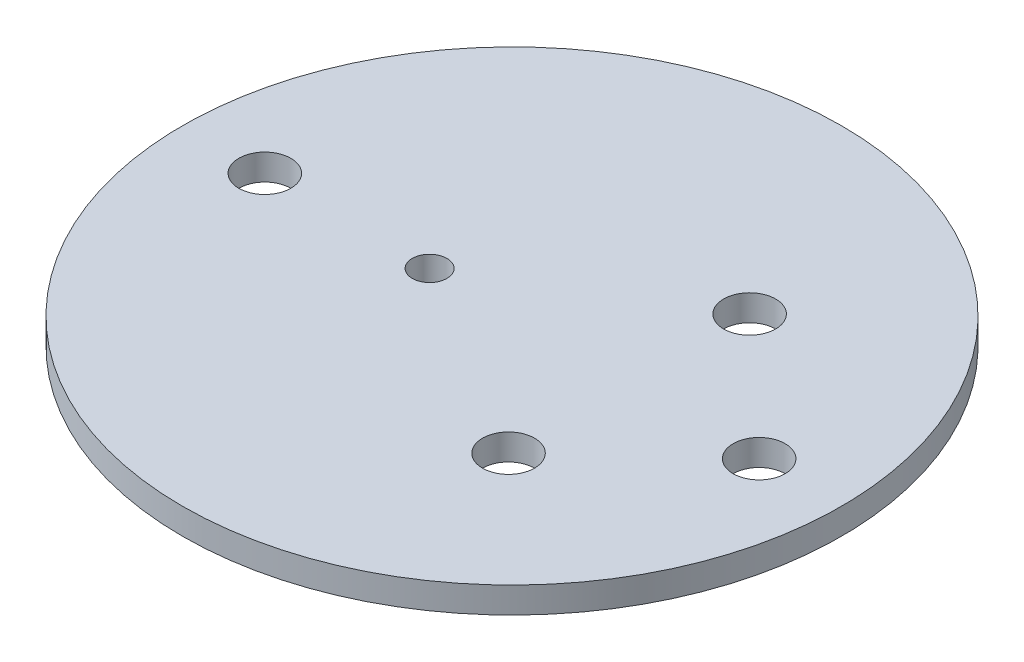
ISO-10303-21;
HEADER;
FILE_DESCRIPTION(('STEP AP214'),'2;1');
FILE_NAME('part.step','',(''),(''),'','','');
FILE_SCHEMA(('AUTOMOTIVE_DESIGN { 1 0 10303 214 1 1 1 1 }'));
ENDSEC;
DATA;
#1=APPLICATION_CONTEXT('core data for automotive mechanical design processes');
#2=APPLICATION_PROTOCOL_DEFINITION('international standard','automotive_design',2000,#1);
#3=PRODUCT_CONTEXT('',#1,'mechanical');
#4=PRODUCT('Part','Part','',(#3));
#5=PRODUCT_RELATED_PRODUCT_CATEGORY('part','',(#4));
#6=PRODUCT_DEFINITION_FORMATION('','',#4);
#7=PRODUCT_DEFINITION_CONTEXT('part definition',#1,'design');
#8=PRODUCT_DEFINITION('design','',#6,#7);
#9=PRODUCT_DEFINITION_SHAPE('','',#8);
#10=(LENGTH_UNIT() NAMED_UNIT(*) SI_UNIT(.MILLI.,.METRE.));
#11=(NAMED_UNIT(*) PLANE_ANGLE_UNIT() SI_UNIT($,.RADIAN.));
#12=(NAMED_UNIT(*) SI_UNIT($,.STERADIAN.) SOLID_ANGLE_UNIT());
#13=UNCERTAINTY_MEASURE_WITH_UNIT(LENGTH_MEASURE(1.E-05),#10,'distance_accuracy_value','');
#14=(GEOMETRIC_REPRESENTATION_CONTEXT(3) GLOBAL_UNCERTAINTY_ASSIGNED_CONTEXT((#13)) GLOBAL_UNIT_ASSIGNED_CONTEXT((#10,
#11,#12)) REPRESENTATION_CONTEXT('',''));
#15=CARTESIAN_POINT('',(0.,0.,0.));
#16=DIRECTION('',(0.,0.,1.));
#17=DIRECTION('',(1.,0.,0.));
#18=AXIS2_PLACEMENT_3D('',#15,#16,#17);
#19=CARTESIAN_POINT('',(28.5,-3.,0.));
#20=DIRECTION('',(0.,1.,0.));
#21=DIRECTION('',(0.,0.,1.));
#22=AXIS2_PLACEMENT_3D('',#19,#20,#21);
#23=CYLINDRICAL_SURFACE('',#22,3.);
#24=CARTESIAN_POINT('',(28.5,-3.,0.));
#25=DIRECTION('',(0.,1.,0.));
#26=DIRECTION('',(0.,0.,1.));
#27=AXIS2_PLACEMENT_3D('',#24,#25,#26);
#28=CIRCLE('',#27,3.);
#29=CARTESIAN_POINT('',(28.5,-3.,2.99999999999999));
#30=VERTEX_POINT('',#29);
#31=EDGE_CURVE('E44',#30,#30,#28,.T.);
#32=ORIENTED_EDGE('',*,*,#31,.F.);
#33=EDGE_LOOP('',(#32));
#34=FACE_BOUND('',#33,.T.);
#35=CARTESIAN_POINT('',(28.5,0.,0.));
#36=DIRECTION('',(0.,1.,0.));
#37=DIRECTION('',(0.,0.,1.));
#38=AXIS2_PLACEMENT_3D('',#35,#36,#37);
#39=CIRCLE('',#38,3.);
#40=CARTESIAN_POINT('',(28.5,0.,2.99999999999999));
#41=VERTEX_POINT('',#40);
#42=EDGE_CURVE('E64',#41,#41,#39,.T.);
#43=ORIENTED_EDGE('',*,*,#42,.T.);
#44=EDGE_LOOP('',(#43));
#45=FACE_BOUND('',#44,.T.);
#46=ADVANCED_FACE('F36',(#34,#45),#23,.F.);
#47=CARTESIAN_POINT('',(-28.5,-3.,0.));
#48=DIRECTION('',(0.,1.,0.));
#49=DIRECTION('',(0.,0.,1.));
#50=AXIS2_PLACEMENT_3D('',#47,#48,#49);
#51=CYLINDRICAL_SURFACE('',#50,3.);
#52=CARTESIAN_POINT('',(-28.5,-3.,0.));
#53=DIRECTION('',(0.,1.,0.));
#54=DIRECTION('',(0.,0.,1.));
#55=AXIS2_PLACEMENT_3D('',#52,#53,#54);
#56=CIRCLE('',#55,3.);
#57=CARTESIAN_POINT('',(-28.5,-3.,3.));
#58=VERTEX_POINT('',#57);
#59=EDGE_CURVE('E49',#58,#58,#56,.T.);
#60=ORIENTED_EDGE('',*,*,#59,.F.);
#61=EDGE_LOOP('',(#60));
#62=FACE_BOUND('',#61,.T.);
#63=CARTESIAN_POINT('',(-28.5,0.,0.));
#64=DIRECTION('',(0.,1.,0.));
#65=DIRECTION('',(0.,0.,1.));
#66=AXIS2_PLACEMENT_3D('',#63,#64,#65);
#67=CIRCLE('',#66,3.);
#68=CARTESIAN_POINT('',(-28.5,0.,3.));
#69=VERTEX_POINT('',#68);
#70=EDGE_CURVE('E62',#69,#69,#67,.T.);
#71=ORIENTED_EDGE('',*,*,#70,.T.);
#72=EDGE_LOOP('',(#71));
#73=FACE_BOUND('',#72,.T.);
#74=ADVANCED_FACE('F88',(#62,#73),#51,.F.);
#75=CARTESIAN_POINT('',(13.5,-3.,-13.9));
#76=DIRECTION('',(0.,1.,0.));
#77=DIRECTION('',(0.,0.,1.));
#78=AXIS2_PLACEMENT_3D('',#75,#76,#77);
#79=CYLINDRICAL_SURFACE('',#78,3.);
#80=CARTESIAN_POINT('',(13.5,-3.,-13.9));
#81=DIRECTION('',(0.,1.,0.));
#82=DIRECTION('',(0.,0.,1.));
#83=AXIS2_PLACEMENT_3D('',#80,#81,#82);
#84=CIRCLE('',#83,3.);
#85=CARTESIAN_POINT('',(13.5,-3.,-10.9));
#86=VERTEX_POINT('',#85);
#87=EDGE_CURVE('E78',#86,#86,#84,.T.);
#88=ORIENTED_EDGE('',*,*,#87,.F.);
#89=EDGE_LOOP('',(#88));
#90=FACE_BOUND('',#89,.T.);
#91=CARTESIAN_POINT('',(13.5,0.,-13.9));
#92=DIRECTION('',(0.,1.,0.));
#93=DIRECTION('',(0.,0.,1.));
#94=AXIS2_PLACEMENT_3D('',#91,#92,#93);
#95=CIRCLE('',#94,3.);
#96=CARTESIAN_POINT('',(13.5,0.,-10.9));
#97=VERTEX_POINT('',#96);
#98=EDGE_CURVE('E59',#97,#97,#95,.T.);
#99=ORIENTED_EDGE('',*,*,#98,.T.);
#100=EDGE_LOOP('',(#99));
#101=FACE_BOUND('',#100,.T.);
#102=ADVANCED_FACE('F91',(#90,#101),#79,.F.);
#103=CARTESIAN_POINT('',(13.5,-3.,13.9));
#104=DIRECTION('',(0.,1.,0.));
#105=DIRECTION('',(0.,0.,1.));
#106=AXIS2_PLACEMENT_3D('',#103,#104,#105);
#107=CYLINDRICAL_SURFACE('',#106,3.);
#108=CARTESIAN_POINT('',(13.5,-3.,13.9));
#109=DIRECTION('',(0.,1.,0.));
#110=DIRECTION('',(0.,0.,1.));
#111=AXIS2_PLACEMENT_3D('',#108,#109,#110);
#112=CIRCLE('',#111,3.);
#113=CARTESIAN_POINT('',(13.5,-3.,16.9));
#114=VERTEX_POINT('',#113);
#115=EDGE_CURVE('E73',#114,#114,#112,.T.);
#116=ORIENTED_EDGE('',*,*,#115,.F.);
#117=EDGE_LOOP('',(#116));
#118=FACE_BOUND('',#117,.T.);
#119=CARTESIAN_POINT('',(13.5,0.,13.9));
#120=DIRECTION('',(0.,1.,0.));
#121=DIRECTION('',(0.,0.,1.));
#122=AXIS2_PLACEMENT_3D('',#119,#120,#121);
#123=CIRCLE('',#122,3.);
#124=CARTESIAN_POINT('',(13.5,0.,16.9));
#125=VERTEX_POINT('',#124);
#126=EDGE_CURVE('E56',#125,#125,#123,.T.);
#127=ORIENTED_EDGE('',*,*,#126,.T.);
#128=EDGE_LOOP('',(#127));
#129=FACE_BOUND('',#128,.T.);
#130=ADVANCED_FACE('F116',(#118,#129),#107,.F.);
#131=CARTESIAN_POINT('',(-9.5,-3.,0.));
#132=DIRECTION('',(0.,1.,0.));
#133=DIRECTION('',(0.,0.,1.));
#134=AXIS2_PLACEMENT_3D('',#131,#132,#133);
#135=CYLINDRICAL_SURFACE('',#134,2.);
#136=CARTESIAN_POINT('',(-9.5,-3.,0.));
#137=DIRECTION('',(0.,1.,0.));
#138=DIRECTION('',(0.,0.,1.));
#139=AXIS2_PLACEMENT_3D('',#136,#137,#138);
#140=CIRCLE('',#139,2.);
#141=CARTESIAN_POINT('',(-9.5,-3.,2.));
#142=VERTEX_POINT('',#141);
#143=EDGE_CURVE('E69',#142,#142,#140,.T.);
#144=ORIENTED_EDGE('',*,*,#143,.F.);
#145=EDGE_LOOP('',(#144));
#146=FACE_BOUND('',#145,.T.);
#147=CARTESIAN_POINT('',(-9.5,0.,0.));
#148=DIRECTION('',(0.,1.,0.));
#149=DIRECTION('',(0.,0.,1.));
#150=AXIS2_PLACEMENT_3D('',#147,#148,#149);
#151=CIRCLE('',#150,2.);
#152=CARTESIAN_POINT('',(-9.5,0.,2.));
#153=VERTEX_POINT('',#152);
#154=EDGE_CURVE('E53',#153,#153,#151,.T.);
#155=ORIENTED_EDGE('',*,*,#154,.T.);
#156=EDGE_LOOP('',(#155));
#157=FACE_BOUND('',#156,.T.);
#158=ADVANCED_FACE('F38',(#146,#157),#135,.F.);
#159=CARTESIAN_POINT('',(0.,-3.,0.));
#160=DIRECTION('',(0.,1.,0.));
#161=DIRECTION('',(0.,0.,1.));
#162=AXIS2_PLACEMENT_3D('',#159,#160,#161);
#163=CYLINDRICAL_SURFACE('',#162,38.);
#164=CARTESIAN_POINT('',(0.,-3.,0.));
#165=DIRECTION('',(0.,1.,0.));
#166=DIRECTION('',(0.,0.,1.));
#167=AXIS2_PLACEMENT_3D('',#164,#165,#166);
#168=CIRCLE('',#167,38.);
#169=CARTESIAN_POINT('',(0.,-3.,38.));
#170=VERTEX_POINT('',#169);
#171=EDGE_CURVE('E10',#170,#170,#168,.T.);
#172=ORIENTED_EDGE('',*,*,#171,.T.);
#173=EDGE_LOOP('',(#172));
#174=FACE_BOUND('',#173,.T.);
#175=CARTESIAN_POINT('',(0.,0.,0.));
#176=DIRECTION('',(0.,1.,0.));
#177=DIRECTION('',(0.,0.,1.));
#178=AXIS2_PLACEMENT_3D('',#175,#176,#177);
#179=CIRCLE('',#178,38.);
#180=CARTESIAN_POINT('',(0.,0.,38.));
#181=VERTEX_POINT('',#180);
#182=EDGE_CURVE('E40',#181,#181,#179,.T.);
#183=ORIENTED_EDGE('',*,*,#182,.F.);
#184=EDGE_LOOP('',(#183));
#185=FACE_BOUND('',#184,.T.);
#186=ADVANCED_FACE('F103',(#174,#185),#163,.T.);
#187=CARTESIAN_POINT('',(0.,-3.,0.));
#188=DIRECTION('',(0.,1.,0.));
#189=DIRECTION('',(0.,0.,1.));
#190=AXIS2_PLACEMENT_3D('',#187,#188,#189);
#191=PLANE('',#190);
#192=ORIENTED_EDGE('',*,*,#143,.T.);
#193=EDGE_LOOP('',(#192));
#194=FACE_BOUND('',#193,.T.);
#195=ORIENTED_EDGE('',*,*,#115,.T.);
#196=EDGE_LOOP('',(#195));
#197=FACE_BOUND('',#196,.T.);
#198=ORIENTED_EDGE('',*,*,#87,.T.);
#199=EDGE_LOOP('',(#198));
#200=FACE_BOUND('',#199,.T.);
#201=ORIENTED_EDGE('',*,*,#59,.T.);
#202=EDGE_LOOP('',(#201));
#203=FACE_BOUND('',#202,.T.);
#204=ORIENTED_EDGE('',*,*,#31,.T.);
#205=EDGE_LOOP('',(#204));
#206=FACE_BOUND('',#205,.T.);
#207=ORIENTED_EDGE('',*,*,#171,.F.);
#208=EDGE_LOOP('',(#207));
#209=FACE_BOUND('',#208,.T.);
#210=ADVANCED_FACE('F85',(#194,#197,#200,#203,#206,#209),#191,.F.);
#211=CARTESIAN_POINT('',(0.,0.,0.));
#212=DIRECTION('',(0.,1.,0.));
#213=DIRECTION('',(0.,0.,1.));
#214=AXIS2_PLACEMENT_3D('',#211,#212,#213);
#215=PLANE('',#214);
#216=ORIENTED_EDGE('',*,*,#154,.F.);
#217=EDGE_LOOP('',(#216));
#218=FACE_BOUND('',#217,.T.);
#219=ORIENTED_EDGE('',*,*,#126,.F.);
#220=EDGE_LOOP('',(#219));
#221=FACE_BOUND('',#220,.T.);
#222=ORIENTED_EDGE('',*,*,#98,.F.);
#223=EDGE_LOOP('',(#222));
#224=FACE_BOUND('',#223,.T.);
#225=ORIENTED_EDGE('',*,*,#70,.F.);
#226=EDGE_LOOP('',(#225));
#227=FACE_BOUND('',#226,.T.);
#228=ORIENTED_EDGE('',*,*,#42,.F.);
#229=EDGE_LOOP('',(#228));
#230=FACE_BOUND('',#229,.T.);
#231=ORIENTED_EDGE('',*,*,#182,.T.);
#232=EDGE_LOOP('',(#231));
#233=FACE_BOUND('',#232,.T.);
#234=ADVANCED_FACE('F95',(#218,#221,#224,#227,#230,#233),#215,.T.);
#235=CLOSED_SHELL('',(#46,#74,#102,#130,#158,#186,#210,#234));
#236=MANIFOLD_SOLID_BREP('B2',#235);
#237=ADVANCED_BREP_SHAPE_REPRESENTATION('',(#18,#236),#14);
#238=SHAPE_DEFINITION_REPRESENTATION(#9,#237);
ENDSEC;
END-ISO-10303-21;
